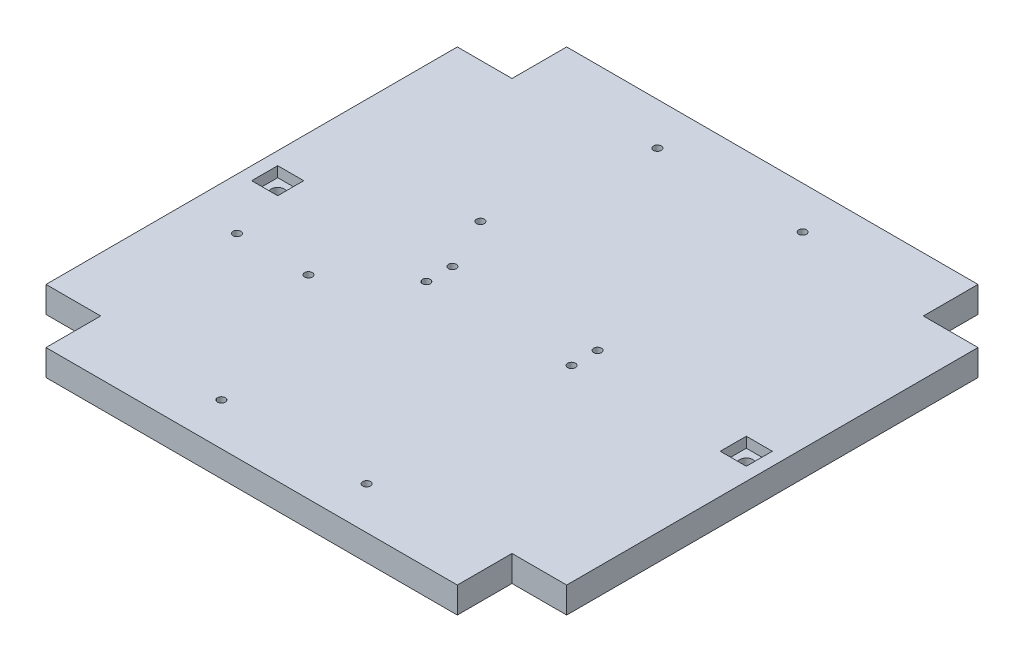
ISO-10303-21;
HEADER;
FILE_DESCRIPTION(('STEP AP214'),'2;1');
FILE_NAME('part.step','',(''),(''),'','','');
FILE_SCHEMA(('AUTOMOTIVE_DESIGN { 1 0 10303 214 1 1 1 1 }'));
ENDSEC;
DATA;
#1=APPLICATION_CONTEXT('core data for automotive mechanical design processes');
#2=APPLICATION_PROTOCOL_DEFINITION('international standard','automotive_design',2000,#1);
#3=PRODUCT_CONTEXT('',#1,'mechanical');
#4=PRODUCT('Part','Part','',(#3));
#5=PRODUCT_RELATED_PRODUCT_CATEGORY('part','',(#4));
#6=PRODUCT_DEFINITION_FORMATION('','',#4);
#7=PRODUCT_DEFINITION_CONTEXT('part definition',#1,'design');
#8=PRODUCT_DEFINITION('design','',#6,#7);
#9=PRODUCT_DEFINITION_SHAPE('','',#8);
#10=(LENGTH_UNIT() NAMED_UNIT(*) SI_UNIT(.MILLI.,.METRE.));
#11=(NAMED_UNIT(*) PLANE_ANGLE_UNIT() SI_UNIT($,.RADIAN.));
#12=(NAMED_UNIT(*) SI_UNIT($,.STERADIAN.) SOLID_ANGLE_UNIT());
#13=UNCERTAINTY_MEASURE_WITH_UNIT(LENGTH_MEASURE(1.E-05),#10,'distance_accuracy_value','');
#14=(GEOMETRIC_REPRESENTATION_CONTEXT(3) GLOBAL_UNCERTAINTY_ASSIGNED_CONTEXT((#13)) GLOBAL_UNIT_ASSIGNED_CONTEXT((#10,
#11,#12)) REPRESENTATION_CONTEXT('',''));
#15=CARTESIAN_POINT('',(0.,0.,0.));
#16=DIRECTION('',(0.,0.,1.));
#17=DIRECTION('',(1.,0.,0.));
#18=AXIS2_PLACEMENT_3D('',#15,#16,#17);
#19=CARTESIAN_POINT('',(90.,0.,0.));
#20=DIRECTION('',(0.,1.,0.));
#21=DIRECTION('',(0.,0.,1.));
#22=AXIS2_PLACEMENT_3D('',#19,#20,#21);
#23=CYLINDRICAL_SURFACE('',#22,2.5);
#24=CARTESIAN_POINT('',(90.,0.,0.));
#25=DIRECTION('',(0.,1.,0.));
#26=DIRECTION('',(0.,0.,-1.));
#27=AXIS2_PLACEMENT_3D('',#24,#25,#26);
#28=CIRCLE('',#27,2.5);
#29=CARTESIAN_POINT('',(90.,0.,-2.5));
#30=VERTEX_POINT('',#29);
#31=EDGE_CURVE('E358',#30,#30,#28,.T.);
#32=ORIENTED_EDGE('',*,*,#31,.F.);
#33=EDGE_LOOP('',(#32));
#34=FACE_BOUND('',#33,.T.);
#35=CARTESIAN_POINT('',(90.,6.,0.));
#36=DIRECTION('',(0.,1.,0.));
#37=DIRECTION('',(0.,0.,1.));
#38=AXIS2_PLACEMENT_3D('',#35,#36,#37);
#39=CIRCLE('',#38,2.5);
#40=CARTESIAN_POINT('',(90.,6.,2.5));
#41=VERTEX_POINT('',#40);
#42=EDGE_CURVE('E43',#41,#41,#39,.F.);
#43=ORIENTED_EDGE('',*,*,#42,.F.);
#44=EDGE_LOOP('',(#43));
#45=FACE_BOUND('',#44,.T.);
#46=ADVANCED_FACE('F39',(#34,#45),#23,.F.);
#47=CARTESIAN_POINT('',(-79.,10.,-100.));
#48=DIRECTION('',(0.,0.,1.));
#49=DIRECTION('',(1.,0.,0.));
#50=AXIS2_PLACEMENT_3D('',#47,#48,#49);
#51=PLANE('',#50);
#52=DIRECTION('',(-1.,0.,0.));
#53=VECTOR('',#52,1.);
#54=CARTESIAN_POINT('',(-79.,0.,-100.));
#55=LINE('',#54,#53);
#56=CARTESIAN_POINT('',(79.,0.,-100.));
#57=VERTEX_POINT('',#56);
#58=CARTESIAN_POINT('',(-79.,0.,-100.));
#59=VERTEX_POINT('',#58);
#60=EDGE_CURVE('E366',#57,#59,#55,.T.);
#61=ORIENTED_EDGE('',*,*,#60,.T.);
#62=DIRECTION('',(0.,-1.,0.));
#63=VECTOR('',#62,1.);
#64=CARTESIAN_POINT('',(-79.,10.,-100.));
#65=LINE('',#64,#63);
#66=CARTESIAN_POINT('',(-79.,10.,-100.));
#67=VERTEX_POINT('',#66);
#68=EDGE_CURVE('E11',#67,#59,#65,.T.);
#69=ORIENTED_EDGE('',*,*,#68,.F.);
#70=DIRECTION('',(-1.,0.,0.));
#71=VECTOR('',#70,1.);
#72=CARTESIAN_POINT('',(-79.,10.,-100.));
#73=LINE('',#72,#71);
#74=CARTESIAN_POINT('',(79.,10.,-100.));
#75=VERTEX_POINT('',#74);
#76=EDGE_CURVE('E370',#75,#67,#73,.T.);
#77=ORIENTED_EDGE('',*,*,#76,.F.);
#78=DIRECTION('',(0.,-1.,0.));
#79=VECTOR('',#78,1.);
#80=CARTESIAN_POINT('',(79.,10.,-100.));
#81=LINE('',#80,#79);
#82=EDGE_CURVE('E408',#75,#57,#81,.T.);
#83=ORIENTED_EDGE('',*,*,#82,.T.);
#84=EDGE_LOOP('',(#61,#69,#77,#83));
#85=FACE_BOUND('',#84,.T.);
#86=ADVANCED_FACE('F41',(#85),#51,.F.);
#87=CARTESIAN_POINT('',(-79.,10.,-100.));
#88=DIRECTION('',(1.,0.,0.));
#89=DIRECTION('',(0.,0.,-1.));
#90=AXIS2_PLACEMENT_3D('',#87,#88,#89);
#91=PLANE('',#90);
#92=DIRECTION('',(0.,0.,1.));
#93=VECTOR('',#92,1.);
#94=CARTESIAN_POINT('',(-79.,0.,-100.));
#95=LINE('',#94,#93);
#96=CARTESIAN_POINT('',(-79.,0.,-79.));
#97=VERTEX_POINT('',#96);
#98=EDGE_CURVE('E412',#59,#97,#95,.T.);
#99=ORIENTED_EDGE('',*,*,#98,.T.);
#100=DIRECTION('',(0.,-1.,0.));
#101=VECTOR('',#100,1.);
#102=CARTESIAN_POINT('',(-79.,10.,-79.));
#103=LINE('',#102,#101);
#104=CARTESIAN_POINT('',(-79.,10.,-79.));
#105=VERTEX_POINT('',#104);
#106=EDGE_CURVE('E49',#105,#97,#103,.T.);
#107=ORIENTED_EDGE('',*,*,#106,.F.);
#108=DIRECTION('',(0.,0.,1.));
#109=VECTOR('',#108,1.);
#110=CARTESIAN_POINT('',(-79.,10.,-100.));
#111=LINE('',#110,#109);
#112=EDGE_CURVE('E374',#67,#105,#111,.T.);
#113=ORIENTED_EDGE('',*,*,#112,.F.);
#114=ORIENTED_EDGE('',*,*,#68,.T.);
#115=EDGE_LOOP('',(#99,#107,#113,#114));
#116=FACE_BOUND('',#115,.T.);
#117=ADVANCED_FACE('F501',(#116),#91,.F.);
#118=CARTESIAN_POINT('',(-79.,10.,-79.));
#119=DIRECTION('',(0.,0.,1.));
#120=DIRECTION('',(1.,0.,0.));
#121=AXIS2_PLACEMENT_3D('',#118,#119,#120);
#122=PLANE('',#121);
#123=DIRECTION('',(-1.,0.,0.));
#124=VECTOR('',#123,1.);
#125=CARTESIAN_POINT('',(-79.,0.,-79.));
#126=LINE('',#125,#124);
#127=CARTESIAN_POINT('',(-100.,0.,-79.));
#128=VERTEX_POINT('',#127);
#129=EDGE_CURVE('E415',#97,#128,#126,.T.);
#130=ORIENTED_EDGE('',*,*,#129,.T.);
#131=DIRECTION('',(0.,-1.,0.));
#132=VECTOR('',#131,1.);
#133=CARTESIAN_POINT('',(-100.,10.,-79.));
#134=LINE('',#133,#132);
#135=CARTESIAN_POINT('',(-100.,10.,-79.));
#136=VERTEX_POINT('',#135);
#137=EDGE_CURVE('E479',#136,#128,#134,.T.);
#138=ORIENTED_EDGE('',*,*,#137,.F.);
#139=DIRECTION('',(-1.,0.,0.));
#140=VECTOR('',#139,1.);
#141=CARTESIAN_POINT('',(-79.,10.,-79.));
#142=LINE('',#141,#140);
#143=EDGE_CURVE('E378',#105,#136,#142,.T.);
#144=ORIENTED_EDGE('',*,*,#143,.F.);
#145=ORIENTED_EDGE('',*,*,#106,.T.);
#146=EDGE_LOOP('',(#130,#138,#144,#145));
#147=FACE_BOUND('',#146,.T.);
#148=ADVANCED_FACE('F551',(#147),#122,.F.);
#149=CARTESIAN_POINT('',(-100.,10.,79.));
#150=DIRECTION('',(1.,0.,0.));
#151=DIRECTION('',(0.,0.,-1.));
#152=AXIS2_PLACEMENT_3D('',#149,#150,#151);
#153=PLANE('',#152);
#154=DIRECTION('',(0.,0.,1.));
#155=VECTOR('',#154,1.);
#156=CARTESIAN_POINT('',(-100.,0.,79.));
#157=LINE('',#156,#155);
#158=CARTESIAN_POINT('',(-100.,0.,79.));
#159=VERTEX_POINT('',#158);
#160=EDGE_CURVE('E418',#128,#159,#157,.T.);
#161=ORIENTED_EDGE('',*,*,#160,.T.);
#162=DIRECTION('',(0.,-1.,0.));
#163=VECTOR('',#162,1.);
#164=CARTESIAN_POINT('',(-100.,10.,79.));
#165=LINE('',#164,#163);
#166=CARTESIAN_POINT('',(-100.,10.,79.));
#167=VERTEX_POINT('',#166);
#168=EDGE_CURVE('E475',#167,#159,#165,.T.);
#169=ORIENTED_EDGE('',*,*,#168,.F.);
#170=DIRECTION('',(0.,0.,1.));
#171=VECTOR('',#170,1.);
#172=CARTESIAN_POINT('',(-100.,10.,79.));
#173=LINE('',#172,#171);
#174=EDGE_CURVE('E381',#136,#167,#173,.T.);
#175=ORIENTED_EDGE('',*,*,#174,.F.);
#176=ORIENTED_EDGE('',*,*,#137,.T.);
#177=EDGE_LOOP('',(#161,#169,#175,#176));
#178=FACE_BOUND('',#177,.T.);
#179=ADVANCED_FACE('F547',(#178),#153,.F.);
#180=CARTESIAN_POINT('',(-78.9999999999999,10.,79.));
#181=DIRECTION('',(0.,0.,-1.));
#182=DIRECTION('',(-1.,0.,0.));
#183=AXIS2_PLACEMENT_3D('',#180,#181,#182);
#184=PLANE('',#183);
#185=DIRECTION('',(1.,0.,0.));
#186=VECTOR('',#185,1.);
#187=CARTESIAN_POINT('',(-78.9999999999999,0.,79.));
#188=LINE('',#187,#186);
#189=CARTESIAN_POINT('',(-78.9999999999999,0.,79.));
#190=VERTEX_POINT('',#189);
#191=EDGE_CURVE('E421',#159,#190,#188,.T.);
#192=ORIENTED_EDGE('',*,*,#191,.T.);
#193=DIRECTION('',(0.,-1.,0.));
#194=VECTOR('',#193,1.);
#195=CARTESIAN_POINT('',(-78.9999999999999,10.,79.));
#196=LINE('',#195,#194);
#197=CARTESIAN_POINT('',(-78.9999999999999,10.,79.));
#198=VERTEX_POINT('',#197);
#199=EDGE_CURVE('E471',#198,#190,#196,.T.);
#200=ORIENTED_EDGE('',*,*,#199,.F.);
#201=DIRECTION('',(1.,0.,0.));
#202=VECTOR('',#201,1.);
#203=CARTESIAN_POINT('',(-78.9999999999999,10.,79.));
#204=LINE('',#203,#202);
#205=EDGE_CURVE('E384',#167,#198,#204,.T.);
#206=ORIENTED_EDGE('',*,*,#205,.F.);
#207=ORIENTED_EDGE('',*,*,#168,.T.);
#208=EDGE_LOOP('',(#192,#200,#206,#207));
#209=FACE_BOUND('',#208,.T.);
#210=ADVANCED_FACE('F543',(#209),#184,.F.);
#211=CARTESIAN_POINT('',(-78.9999999999999,10.,100.));
#212=DIRECTION('',(1.,0.,0.));
#213=DIRECTION('',(0.,0.,-1.));
#214=AXIS2_PLACEMENT_3D('',#211,#212,#213);
#215=PLANE('',#214);
#216=DIRECTION('',(0.,0.,1.));
#217=VECTOR('',#216,1.);
#218=CARTESIAN_POINT('',(-78.9999999999999,0.,100.));
#219=LINE('',#218,#217);
#220=CARTESIAN_POINT('',(-78.9999999999999,0.,100.));
#221=VERTEX_POINT('',#220);
#222=EDGE_CURVE('E424',#190,#221,#219,.T.);
#223=ORIENTED_EDGE('',*,*,#222,.T.);
#224=DIRECTION('',(0.,-1.,0.));
#225=VECTOR('',#224,1.);
#226=CARTESIAN_POINT('',(-78.9999999999999,10.,100.));
#227=LINE('',#226,#225);
#228=CARTESIAN_POINT('',(-78.9999999999999,10.,100.));
#229=VERTEX_POINT('',#228);
#230=EDGE_CURVE('E467',#229,#221,#227,.T.);
#231=ORIENTED_EDGE('',*,*,#230,.F.);
#232=DIRECTION('',(0.,0.,1.));
#233=VECTOR('',#232,1.);
#234=CARTESIAN_POINT('',(-78.9999999999999,10.,100.));
#235=LINE('',#234,#233);
#236=EDGE_CURVE('E387',#198,#229,#235,.T.);
#237=ORIENTED_EDGE('',*,*,#236,.F.);
#238=ORIENTED_EDGE('',*,*,#199,.T.);
#239=EDGE_LOOP('',(#223,#231,#237,#238));
#240=FACE_BOUND('',#239,.T.);
#241=ADVANCED_FACE('F539',(#240),#215,.F.);
#242=CARTESIAN_POINT('',(-78.9999999999999,10.,100.));
#243=DIRECTION('',(0.,0.,-1.));
#244=DIRECTION('',(-1.,0.,0.));
#245=AXIS2_PLACEMENT_3D('',#242,#243,#244);
#246=PLANE('',#245);
#247=DIRECTION('',(1.,0.,0.));
#248=VECTOR('',#247,1.);
#249=CARTESIAN_POINT('',(-78.9999999999999,0.,100.));
#250=LINE('',#249,#248);
#251=CARTESIAN_POINT('',(79.,0.,100.));
#252=VERTEX_POINT('',#251);
#253=EDGE_CURVE('E427',#221,#252,#250,.T.);
#254=ORIENTED_EDGE('',*,*,#253,.T.);
#255=DIRECTION('',(0.,-1.,0.));
#256=VECTOR('',#255,1.);
#257=CARTESIAN_POINT('',(79.,10.,100.));
#258=LINE('',#257,#256);
#259=CARTESIAN_POINT('',(79.,10.,100.));
#260=VERTEX_POINT('',#259);
#261=EDGE_CURVE('E463',#260,#252,#258,.T.);
#262=ORIENTED_EDGE('',*,*,#261,.F.);
#263=DIRECTION('',(1.,0.,0.));
#264=VECTOR('',#263,1.);
#265=CARTESIAN_POINT('',(-78.9999999999999,10.,100.));
#266=LINE('',#265,#264);
#267=EDGE_CURVE('E390',#229,#260,#266,.T.);
#268=ORIENTED_EDGE('',*,*,#267,.F.);
#269=ORIENTED_EDGE('',*,*,#230,.T.);
#270=EDGE_LOOP('',(#254,#262,#268,#269));
#271=FACE_BOUND('',#270,.T.);
#272=ADVANCED_FACE('F535',(#271),#246,.F.);
#273=CARTESIAN_POINT('',(79.,10.,100.));
#274=DIRECTION('',(-1.,0.,0.));
#275=DIRECTION('',(0.,0.,1.));
#276=AXIS2_PLACEMENT_3D('',#273,#274,#275);
#277=PLANE('',#276);
#278=DIRECTION('',(0.,0.,-1.));
#279=VECTOR('',#278,1.);
#280=CARTESIAN_POINT('',(79.,0.,100.));
#281=LINE('',#280,#279);
#282=CARTESIAN_POINT('',(79.,0.,79.));
#283=VERTEX_POINT('',#282);
#284=EDGE_CURVE('E430',#252,#283,#281,.T.);
#285=ORIENTED_EDGE('',*,*,#284,.T.);
#286=DIRECTION('',(0.,-1.,0.));
#287=VECTOR('',#286,1.);
#288=CARTESIAN_POINT('',(79.,10.,79.));
#289=LINE('',#288,#287);
#290=CARTESIAN_POINT('',(79.,10.,79.));
#291=VERTEX_POINT('',#290);
#292=EDGE_CURVE('E459',#291,#283,#289,.T.);
#293=ORIENTED_EDGE('',*,*,#292,.F.);
#294=DIRECTION('',(0.,0.,-1.));
#295=VECTOR('',#294,1.);
#296=CARTESIAN_POINT('',(79.,10.,100.));
#297=LINE('',#296,#295);
#298=EDGE_CURVE('E393',#260,#291,#297,.T.);
#299=ORIENTED_EDGE('',*,*,#298,.F.);
#300=ORIENTED_EDGE('',*,*,#261,.T.);
#301=EDGE_LOOP('',(#285,#293,#299,#300));
#302=FACE_BOUND('',#301,.T.);
#303=ADVANCED_FACE('F531',(#302),#277,.F.);
#304=CARTESIAN_POINT('',(79.,10.,79.));
#305=DIRECTION('',(0.,0.,-1.));
#306=DIRECTION('',(-1.,0.,0.));
#307=AXIS2_PLACEMENT_3D('',#304,#305,#306);
#308=PLANE('',#307);
#309=DIRECTION('',(1.,0.,0.));
#310=VECTOR('',#309,1.);
#311=CARTESIAN_POINT('',(79.,0.,79.));
#312=LINE('',#311,#310);
#313=CARTESIAN_POINT('',(100.,0.,79.));
#314=VERTEX_POINT('',#313);
#315=EDGE_CURVE('E433',#283,#314,#312,.T.);
#316=ORIENTED_EDGE('',*,*,#315,.T.);
#317=DIRECTION('',(0.,-1.,0.));
#318=VECTOR('',#317,1.);
#319=CARTESIAN_POINT('',(100.,10.,79.));
#320=LINE('',#319,#318);
#321=CARTESIAN_POINT('',(100.,10.,79.));
#322=VERTEX_POINT('',#321);
#323=EDGE_CURVE('E455',#322,#314,#320,.T.);
#324=ORIENTED_EDGE('',*,*,#323,.F.);
#325=DIRECTION('',(1.,0.,0.));
#326=VECTOR('',#325,1.);
#327=CARTESIAN_POINT('',(79.,10.,79.));
#328=LINE('',#327,#326);
#329=EDGE_CURVE('E396',#291,#322,#328,.T.);
#330=ORIENTED_EDGE('',*,*,#329,.F.);
#331=ORIENTED_EDGE('',*,*,#292,.T.);
#332=EDGE_LOOP('',(#316,#324,#330,#331));
#333=FACE_BOUND('',#332,.T.);
#334=ADVANCED_FACE('F527',(#333),#308,.F.);
#335=CARTESIAN_POINT('',(100.,10.,79.));
#336=DIRECTION('',(-1.,0.,0.));
#337=DIRECTION('',(0.,0.,1.));
#338=AXIS2_PLACEMENT_3D('',#335,#336,#337);
#339=PLANE('',#338);
#340=DIRECTION('',(0.,0.,-1.));
#341=VECTOR('',#340,1.);
#342=CARTESIAN_POINT('',(100.,0.,79.));
#343=LINE('',#342,#341);
#344=CARTESIAN_POINT('',(100.,0.,-79.));
#345=VERTEX_POINT('',#344);
#346=EDGE_CURVE('E436',#314,#345,#343,.T.);
#347=ORIENTED_EDGE('',*,*,#346,.T.);
#348=DIRECTION('',(0.,-1.,0.));
#349=VECTOR('',#348,1.);
#350=CARTESIAN_POINT('',(100.,10.,-79.));
#351=LINE('',#350,#349);
#352=CARTESIAN_POINT('',(100.,10.,-79.));
#353=VERTEX_POINT('',#352);
#354=EDGE_CURVE('E451',#353,#345,#351,.T.);
#355=ORIENTED_EDGE('',*,*,#354,.F.);
#356=DIRECTION('',(0.,0.,-1.));
#357=VECTOR('',#356,1.);
#358=CARTESIAN_POINT('',(100.,10.,79.));
#359=LINE('',#358,#357);
#360=EDGE_CURVE('E399',#322,#353,#359,.T.);
#361=ORIENTED_EDGE('',*,*,#360,.F.);
#362=ORIENTED_EDGE('',*,*,#323,.T.);
#363=EDGE_LOOP('',(#347,#355,#361,#362));
#364=FACE_BOUND('',#363,.T.);
#365=ADVANCED_FACE('F523',(#364),#339,.F.);
#366=CARTESIAN_POINT('',(79.,10.,-79.));
#367=DIRECTION('',(0.,0.,1.));
#368=DIRECTION('',(1.,0.,0.));
#369=AXIS2_PLACEMENT_3D('',#366,#367,#368);
#370=PLANE('',#369);
#371=DIRECTION('',(-1.,0.,0.));
#372=VECTOR('',#371,1.);
#373=CARTESIAN_POINT('',(79.,0.,-79.));
#374=LINE('',#373,#372);
#375=CARTESIAN_POINT('',(79.,0.,-79.));
#376=VERTEX_POINT('',#375);
#377=EDGE_CURVE('E439',#345,#376,#374,.T.);
#378=ORIENTED_EDGE('',*,*,#377,.T.);
#379=DIRECTION('',(0.,-1.,0.));
#380=VECTOR('',#379,1.);
#381=CARTESIAN_POINT('',(79.,10.,-79.));
#382=LINE('',#381,#380);
#383=CARTESIAN_POINT('',(79.,10.,-79.));
#384=VERTEX_POINT('',#383);
#385=EDGE_CURVE('E447',#384,#376,#382,.T.);
#386=ORIENTED_EDGE('',*,*,#385,.F.);
#387=DIRECTION('',(-1.,0.,0.));
#388=VECTOR('',#387,1.);
#389=CARTESIAN_POINT('',(79.,10.,-79.));
#390=LINE('',#389,#388);
#391=EDGE_CURVE('E402',#353,#384,#390,.T.);
#392=ORIENTED_EDGE('',*,*,#391,.F.);
#393=ORIENTED_EDGE('',*,*,#354,.T.);
#394=EDGE_LOOP('',(#378,#386,#392,#393));
#395=FACE_BOUND('',#394,.T.);
#396=ADVANCED_FACE('F519',(#395),#370,.F.);
#397=CARTESIAN_POINT('',(79.,10.,-100.));
#398=DIRECTION('',(-1.,0.,0.));
#399=DIRECTION('',(0.,0.,1.));
#400=AXIS2_PLACEMENT_3D('',#397,#398,#399);
#401=PLANE('',#400);
#402=DIRECTION('',(0.,0.,-1.));
#403=VECTOR('',#402,1.);
#404=CARTESIAN_POINT('',(79.,0.,-100.));
#405=LINE('',#404,#403);
#406=EDGE_CURVE('E375',#376,#57,#405,.T.);
#407=ORIENTED_EDGE('',*,*,#406,.T.);
#408=ORIENTED_EDGE('',*,*,#82,.F.);
#409=DIRECTION('',(0.,0.,-1.));
#410=VECTOR('',#409,1.);
#411=CARTESIAN_POINT('',(79.,10.,-100.));
#412=LINE('',#411,#410);
#413=EDGE_CURVE('E405',#384,#75,#412,.T.);
#414=ORIENTED_EDGE('',*,*,#413,.F.);
#415=ORIENTED_EDGE('',*,*,#385,.T.);
#416=EDGE_LOOP('',(#407,#408,#414,#415));
#417=FACE_BOUND('',#416,.T.);
#418=ADVANCED_FACE('F512',(#417),#401,.F.);
#419=CARTESIAN_POINT('',(0.,10.,0.));
#420=DIRECTION('',(0.,-1.,0.));
#421=DIRECTION('',(0.,0.,-1.));
#422=AXIS2_PLACEMENT_3D('',#419,#420,#421);
#423=PLANE('',#422);
#424=DIRECTION('',(-1.,0.,0.));
#425=VECTOR('',#424,1.);
#426=CARTESIAN_POINT('',(-95.,10.,-5.));
#427=LINE('',#426,#425);
#428=CARTESIAN_POINT('',(-85.,10.,-5.));
#429=VERTEX_POINT('',#428);
#430=CARTESIAN_POINT('',(-95.,10.,-5.));
#431=VERTEX_POINT('',#430);
#432=EDGE_CURVE('E216',#429,#431,#427,.T.);
#433=ORIENTED_EDGE('',*,*,#432,.F.);
#434=DIRECTION('',(0.,0.,-1.));
#435=VECTOR('',#434,1.);
#436=CARTESIAN_POINT('',(-85.,10.,5.));
#437=LINE('',#436,#435);
#438=CARTESIAN_POINT('',(-85.,10.,5.));
#439=VERTEX_POINT('',#438);
#440=EDGE_CURVE('E57',#439,#429,#437,.T.);
#441=ORIENTED_EDGE('',*,*,#440,.F.);
#442=DIRECTION('',(1.,0.,0.));
#443=VECTOR('',#442,1.);
#444=CARTESIAN_POINT('',(-95.,10.,5.));
#445=LINE('',#444,#443);
#446=CARTESIAN_POINT('',(-95.,10.,5.));
#447=VERTEX_POINT('',#446);
#448=EDGE_CURVE('E203',#447,#439,#445,.T.);
#449=ORIENTED_EDGE('',*,*,#448,.F.);
#450=DIRECTION('',(0.,0.,1.));
#451=VECTOR('',#450,1.);
#452=CARTESIAN_POINT('',(-95.,10.,5.));
#453=LINE('',#452,#451);
#454=EDGE_CURVE('E207',#431,#447,#453,.T.);
#455=ORIENTED_EDGE('',*,*,#454,.F.);
#456=EDGE_LOOP('',(#433,#441,#449,#455));
#457=FACE_BOUND('',#456,.T.);
#458=DIRECTION('',(1.,0.,0.));
#459=VECTOR('',#458,1.);
#460=CARTESIAN_POINT('',(95.,10.,5.00000000000001));
#461=LINE('',#460,#459);
#462=CARTESIAN_POINT('',(85.,10.,5.00000000000001));
#463=VERTEX_POINT('',#462);
#464=CARTESIAN_POINT('',(95.,10.,5.00000000000001));
#465=VERTEX_POINT('',#464);
#466=EDGE_CURVE('E252',#463,#465,#461,.T.);
#467=ORIENTED_EDGE('',*,*,#466,.F.);
#468=DIRECTION('',(0.,0.,1.));
#469=VECTOR('',#468,1.);
#470=CARTESIAN_POINT('',(85.,10.,5.00000000000001));
#471=LINE('',#470,#469);
#472=CARTESIAN_POINT('',(85.,10.,-4.99999999999999));
#473=VERTEX_POINT('',#472);
#474=EDGE_CURVE('E65',#473,#463,#471,.T.);
#475=ORIENTED_EDGE('',*,*,#474,.F.);
#476=DIRECTION('',(-1.,0.,0.));
#477=VECTOR('',#476,1.);
#478=CARTESIAN_POINT('',(95.,10.,-4.99999999999999));
#479=LINE('',#478,#477);
#480=CARTESIAN_POINT('',(95.,10.,-4.99999999999999));
#481=VERTEX_POINT('',#480);
#482=EDGE_CURVE('E237',#481,#473,#479,.T.);
#483=ORIENTED_EDGE('',*,*,#482,.F.);
#484=DIRECTION('',(0.,0.,-1.));
#485=VECTOR('',#484,1.);
#486=CARTESIAN_POINT('',(95.,10.,5.00000000000001));
#487=LINE('',#486,#485);
#488=EDGE_CURVE('E256',#465,#481,#487,.T.);
#489=ORIENTED_EDGE('',*,*,#488,.F.);
#490=EDGE_LOOP('',(#467,#475,#483,#489));
#491=FACE_BOUND('',#490,.T.);
#492=CARTESIAN_POINT('',(-37.54,10.,-25.4));
#493=DIRECTION('',(0.,1.,0.));
#494=DIRECTION('',(0.,0.,1.));
#495=AXIS2_PLACEMENT_3D('',#492,#493,#494);
#496=CIRCLE('',#495,1.5);
#497=CARTESIAN_POINT('',(-37.54,10.,-23.9));
#498=VERTEX_POINT('',#497);
#499=EDGE_CURVE('E278',#498,#498,#496,.T.);
#500=ORIENTED_EDGE('',*,*,#499,.F.);
#501=EDGE_LOOP('',(#500));
#502=FACE_BOUND('',#501,.T.);
#503=CARTESIAN_POINT('',(-52.78,10.,25.4));
#504=DIRECTION('',(0.,1.,0.));
#505=DIRECTION('',(0.,0.,1.));
#506=AXIS2_PLACEMENT_3D('',#503,#504,#505);
#507=CIRCLE('',#506,1.5);
#508=CARTESIAN_POINT('',(-52.78,10.,26.9));
#509=VERTEX_POINT('',#508);
#510=EDGE_CURVE('E286',#509,#509,#507,.T.);
#511=ORIENTED_EDGE('',*,*,#510,.F.);
#512=EDGE_LOOP('',(#511));
#513=FACE_BOUND('',#512,.T.);
#514=CARTESIAN_POINT('',(-80.27,10.,25.4));
#515=DIRECTION('',(0.,1.,0.));
#516=DIRECTION('',(0.,0.,1.));
#517=AXIS2_PLACEMENT_3D('',#514,#515,#516);
#518=CIRCLE('',#517,1.5);
#519=CARTESIAN_POINT('',(-80.27,10.,26.9));
#520=VERTEX_POINT('',#519);
#521=EDGE_CURVE('E294',#520,#520,#518,.T.);
#522=ORIENTED_EDGE('',*,*,#521,.F.);
#523=EDGE_LOOP('',(#522));
#524=FACE_BOUND('',#523,.T.);
#525=CARTESIAN_POINT('',(-27.9,10.,5.));
#526=DIRECTION('',(0.,1.,0.));
#527=DIRECTION('',(0.,0.,1.));
#528=AXIS2_PLACEMENT_3D('',#525,#526,#527);
#529=CIRCLE('',#528,1.5);
#530=CARTESIAN_POINT('',(-27.9,10.,6.5));
#531=VERTEX_POINT('',#530);
#532=EDGE_CURVE('E302',#531,#531,#529,.T.);
#533=ORIENTED_EDGE('',*,*,#532,.F.);
#534=EDGE_LOOP('',(#533));
#535=FACE_BOUND('',#534,.T.);
#536=CARTESIAN_POINT('',(-27.9,10.,-83.74));
#537=DIRECTION('',(0.,1.,0.));
#538=DIRECTION('',(0.,0.,-1.));
#539=AXIS2_PLACEMENT_3D('',#536,#537,#538);
#540=CIRCLE('',#539,1.5);
#541=CARTESIAN_POINT('',(-27.9,10.,-85.24));
#542=VERTEX_POINT('',#541);
#543=EDGE_CURVE('E327',#542,#542,#540,.T.);
#544=ORIENTED_EDGE('',*,*,#543,.F.);
#545=EDGE_LOOP('',(#544));
#546=FACE_BOUND('',#545,.T.);
#547=CARTESIAN_POINT('',(-27.9,10.,-5.));
#548=DIRECTION('',(0.,1.,0.));
#549=DIRECTION('',(0.,0.,-1.));
#550=AXIS2_PLACEMENT_3D('',#547,#548,#549);
#551=CIRCLE('',#550,1.5);
#552=CARTESIAN_POINT('',(-27.9,10.,-6.5));
#553=VERTEX_POINT('',#552);
#554=EDGE_CURVE('E326',#553,#553,#551,.T.);
#555=ORIENTED_EDGE('',*,*,#554,.F.);
#556=EDGE_LOOP('',(#555));
#557=FACE_BOUND('',#556,.T.);
#558=CARTESIAN_POINT('',(27.9,10.,-5.));
#559=DIRECTION('',(0.,1.,0.));
#560=DIRECTION('',(0.,0.,1.));
#561=AXIS2_PLACEMENT_3D('',#558,#559,#560);
#562=CIRCLE('',#561,1.5);
#563=CARTESIAN_POINT('',(27.9,10.,-3.5));
#564=VERTEX_POINT('',#563);
#565=EDGE_CURVE('E343',#564,#564,#562,.T.);
#566=ORIENTED_EDGE('',*,*,#565,.F.);
#567=EDGE_LOOP('',(#566));
#568=FACE_BOUND('',#567,.T.);
#569=CARTESIAN_POINT('',(27.9,10.,5.));
#570=DIRECTION('',(0.,1.,0.));
#571=DIRECTION('',(0.,0.,-1.));
#572=AXIS2_PLACEMENT_3D('',#569,#570,#571);
#573=CIRCLE('',#572,1.5);
#574=CARTESIAN_POINT('',(27.9,10.,3.5));
#575=VERTEX_POINT('',#574);
#576=EDGE_CURVE('E303',#575,#575,#573,.T.);
#577=ORIENTED_EDGE('',*,*,#576,.F.);
#578=EDGE_LOOP('',(#577));
#579=FACE_BOUND('',#578,.T.);
#580=CARTESIAN_POINT('',(27.9,10.,83.74));
#581=DIRECTION('',(0.,1.,0.));
#582=DIRECTION('',(0.,0.,-1.));
#583=AXIS2_PLACEMENT_3D('',#580,#581,#582);
#584=CIRCLE('',#583,1.5);
#585=CARTESIAN_POINT('',(27.9,10.,82.24));
#586=VERTEX_POINT('',#585);
#587=EDGE_CURVE('E311',#586,#586,#584,.T.);
#588=ORIENTED_EDGE('',*,*,#587,.F.);
#589=EDGE_LOOP('',(#588));
#590=FACE_BOUND('',#589,.T.);
#591=CARTESIAN_POINT('',(-27.9,10.,83.74));
#592=DIRECTION('',(0.,1.,0.));
#593=DIRECTION('',(0.,0.,1.));
#594=AXIS2_PLACEMENT_3D('',#591,#592,#593);
#595=CIRCLE('',#594,1.5);
#596=CARTESIAN_POINT('',(-27.9,10.,85.24));
#597=VERTEX_POINT('',#596);
#598=EDGE_CURVE('E277',#597,#597,#595,.T.);
#599=ORIENTED_EDGE('',*,*,#598,.F.);
#600=EDGE_LOOP('',(#599));
#601=FACE_BOUND('',#600,.T.);
#602=CARTESIAN_POINT('',(27.9,10.,-83.74));
#603=DIRECTION('',(0.,1.,0.));
#604=DIRECTION('',(0.,0.,1.));
#605=AXIS2_PLACEMENT_3D('',#602,#603,#604);
#606=CIRCLE('',#605,1.5);
#607=CARTESIAN_POINT('',(27.9,10.,-82.24));
#608=VERTEX_POINT('',#607);
#609=EDGE_CURVE('E342',#608,#608,#606,.T.);
#610=ORIENTED_EDGE('',*,*,#609,.F.);
#611=EDGE_LOOP('',(#610));
#612=FACE_BOUND('',#611,.T.);
#613=ORIENTED_EDGE('',*,*,#76,.T.);
#614=ORIENTED_EDGE('',*,*,#112,.T.);
#615=ORIENTED_EDGE('',*,*,#143,.T.);
#616=ORIENTED_EDGE('',*,*,#174,.T.);
#617=ORIENTED_EDGE('',*,*,#205,.T.);
#618=ORIENTED_EDGE('',*,*,#236,.T.);
#619=ORIENTED_EDGE('',*,*,#267,.T.);
#620=ORIENTED_EDGE('',*,*,#298,.T.);
#621=ORIENTED_EDGE('',*,*,#329,.T.);
#622=ORIENTED_EDGE('',*,*,#360,.T.);
#623=ORIENTED_EDGE('',*,*,#391,.T.);
#624=ORIENTED_EDGE('',*,*,#413,.T.);
#625=EDGE_LOOP('',(#613,#614,#615,#616,#617,#618,#619,#620,#621,#622,#623,#624));
#626=FACE_BOUND('',#625,.T.);
#627=ADVANCED_FACE('F508',(#457,#491,#502,#513,#524,#535,#546,#557,#568,#579,#590,#601,#612,
#626),#423,.F.);
#628=CARTESIAN_POINT('',(0.,0.,0.));
#629=DIRECTION('',(0.,-1.,0.));
#630=DIRECTION('',(0.,0.,-1.));
#631=AXIS2_PLACEMENT_3D('',#628,#629,#630);
#632=PLANE('',#631);
#633=CARTESIAN_POINT('',(-37.54,0.,-25.4));
#634=DIRECTION('',(0.,1.,0.));
#635=DIRECTION('',(0.,0.,1.));
#636=AXIS2_PLACEMENT_3D('',#633,#634,#635);
#637=CIRCLE('',#636,1.5);
#638=CARTESIAN_POINT('',(-37.54,0.,-23.9));
#639=VERTEX_POINT('',#638);
#640=EDGE_CURVE('E273',#639,#639,#637,.T.);
#641=ORIENTED_EDGE('',*,*,#640,.T.);
#642=EDGE_LOOP('',(#641));
#643=FACE_BOUND('',#642,.T.);
#644=CARTESIAN_POINT('',(-52.78,0.,25.4));
#645=DIRECTION('',(0.,1.,0.));
#646=DIRECTION('',(0.,0.,1.));
#647=AXIS2_PLACEMENT_3D('',#644,#645,#646);
#648=CIRCLE('',#647,1.5);
#649=CARTESIAN_POINT('',(-52.78,0.,26.9));
#650=VERTEX_POINT('',#649);
#651=EDGE_CURVE('E282',#650,#650,#648,.T.);
#652=ORIENTED_EDGE('',*,*,#651,.T.);
#653=EDGE_LOOP('',(#652));
#654=FACE_BOUND('',#653,.T.);
#655=CARTESIAN_POINT('',(-80.27,0.,25.4));
#656=DIRECTION('',(0.,1.,0.));
#657=DIRECTION('',(0.,0.,1.));
#658=AXIS2_PLACEMENT_3D('',#655,#656,#657);
#659=CIRCLE('',#658,1.5);
#660=CARTESIAN_POINT('',(-80.27,0.,26.9));
#661=VERTEX_POINT('',#660);
#662=EDGE_CURVE('E290',#661,#661,#659,.T.);
#663=ORIENTED_EDGE('',*,*,#662,.T.);
#664=EDGE_LOOP('',(#663));
#665=FACE_BOUND('',#664,.T.);
#666=CARTESIAN_POINT('',(-27.9,0.,5.));
#667=DIRECTION('',(0.,1.,0.));
#668=DIRECTION('',(0.,0.,1.));
#669=AXIS2_PLACEMENT_3D('',#666,#667,#668);
#670=CIRCLE('',#669,1.5);
#671=CARTESIAN_POINT('',(-27.9,0.,6.5));
#672=VERTEX_POINT('',#671);
#673=EDGE_CURVE('E331',#672,#672,#670,.T.);
#674=ORIENTED_EDGE('',*,*,#673,.T.);
#675=EDGE_LOOP('',(#674));
#676=FACE_BOUND('',#675,.T.);
#677=CARTESIAN_POINT('',(-27.9,0.,-83.74));
#678=DIRECTION('',(0.,1.,0.));
#679=DIRECTION('',(0.,0.,-1.));
#680=AXIS2_PLACEMENT_3D('',#677,#678,#679);
#681=CIRCLE('',#680,1.5);
#682=CARTESIAN_POINT('',(-27.9,0.,-85.24));
#683=VERTEX_POINT('',#682);
#684=EDGE_CURVE('E322',#683,#683,#681,.T.);
#685=ORIENTED_EDGE('',*,*,#684,.T.);
#686=EDGE_LOOP('',(#685));
#687=FACE_BOUND('',#686,.T.);
#688=CARTESIAN_POINT('',(-27.9,0.,-5.));
#689=DIRECTION('',(0.,1.,0.));
#690=DIRECTION('',(0.,0.,-1.));
#691=AXIS2_PLACEMENT_3D('',#688,#689,#690);
#692=CIRCLE('',#691,1.5);
#693=CARTESIAN_POINT('',(-27.9,0.,-6.5));
#694=VERTEX_POINT('',#693);
#695=EDGE_CURVE('E347',#694,#694,#692,.T.);
#696=ORIENTED_EDGE('',*,*,#695,.T.);
#697=EDGE_LOOP('',(#696));
#698=FACE_BOUND('',#697,.T.);
#699=CARTESIAN_POINT('',(27.9,0.,-5.));
#700=DIRECTION('',(0.,1.,0.));
#701=DIRECTION('',(0.,0.,1.));
#702=AXIS2_PLACEMENT_3D('',#699,#700,#701);
#703=CIRCLE('',#702,1.5);
#704=CARTESIAN_POINT('',(27.9,0.,-3.5));
#705=VERTEX_POINT('',#704);
#706=EDGE_CURVE('E338',#705,#705,#703,.T.);
#707=ORIENTED_EDGE('',*,*,#706,.T.);
#708=EDGE_LOOP('',(#707));
#709=FACE_BOUND('',#708,.T.);
#710=CARTESIAN_POINT('',(27.9,0.,5.));
#711=DIRECTION('',(0.,1.,0.));
#712=DIRECTION('',(0.,0.,-1.));
#713=AXIS2_PLACEMENT_3D('',#710,#711,#712);
#714=CIRCLE('',#713,1.5);
#715=CARTESIAN_POINT('',(27.9,0.,3.5));
#716=VERTEX_POINT('',#715);
#717=EDGE_CURVE('E298',#716,#716,#714,.T.);
#718=ORIENTED_EDGE('',*,*,#717,.T.);
#719=EDGE_LOOP('',(#718));
#720=FACE_BOUND('',#719,.T.);
#721=CARTESIAN_POINT('',(27.9,0.,83.74));
#722=DIRECTION('',(0.,1.,0.));
#723=DIRECTION('',(0.,0.,-1.));
#724=AXIS2_PLACEMENT_3D('',#721,#722,#723);
#725=CIRCLE('',#724,1.5);
#726=CARTESIAN_POINT('',(27.9,0.,82.24));
#727=VERTEX_POINT('',#726);
#728=EDGE_CURVE('E307',#727,#727,#725,.T.);
#729=ORIENTED_EDGE('',*,*,#728,.T.);
#730=EDGE_LOOP('',(#729));
#731=FACE_BOUND('',#730,.T.);
#732=CARTESIAN_POINT('',(-27.9,0.,83.74));
#733=DIRECTION('',(0.,1.,0.));
#734=DIRECTION('',(0.,0.,1.));
#735=AXIS2_PLACEMENT_3D('',#732,#733,#734);
#736=CIRCLE('',#735,1.5);
#737=CARTESIAN_POINT('',(-27.9,0.,85.24));
#738=VERTEX_POINT('',#737);
#739=EDGE_CURVE('E315',#738,#738,#736,.T.);
#740=ORIENTED_EDGE('',*,*,#739,.T.);
#741=EDGE_LOOP('',(#740));
#742=FACE_BOUND('',#741,.T.);
#743=CARTESIAN_POINT('',(27.9,0.,-83.74));
#744=DIRECTION('',(0.,1.,0.));
#745=DIRECTION('',(0.,0.,1.));
#746=AXIS2_PLACEMENT_3D('',#743,#744,#745);
#747=CIRCLE('',#746,1.5);
#748=CARTESIAN_POINT('',(27.9,0.,-82.24));
#749=VERTEX_POINT('',#748);
#750=EDGE_CURVE('E354',#749,#749,#747,.T.);
#751=ORIENTED_EDGE('',*,*,#750,.T.);
#752=EDGE_LOOP('',(#751));
#753=FACE_BOUND('',#752,.T.);
#754=CARTESIAN_POINT('',(-90.,0.,0.));
#755=DIRECTION('',(0.,1.,0.));
#756=DIRECTION('',(0.,0.,1.));
#757=AXIS2_PLACEMENT_3D('',#754,#755,#756);
#758=CIRCLE('',#757,2.5);
#759=CARTESIAN_POINT('',(-90.,0.,2.5));
#760=VERTEX_POINT('',#759);
#761=EDGE_CURVE('E362',#760,#760,#758,.T.);
#762=ORIENTED_EDGE('',*,*,#761,.T.);
#763=EDGE_LOOP('',(#762));
#764=FACE_BOUND('',#763,.T.);
#765=ORIENTED_EDGE('',*,*,#31,.T.);
#766=EDGE_LOOP('',(#765));
#767=FACE_BOUND('',#766,.T.);
#768=ORIENTED_EDGE('',*,*,#60,.F.);
#769=ORIENTED_EDGE('',*,*,#406,.F.);
#770=ORIENTED_EDGE('',*,*,#377,.F.);
#771=ORIENTED_EDGE('',*,*,#346,.F.);
#772=ORIENTED_EDGE('',*,*,#315,.F.);
#773=ORIENTED_EDGE('',*,*,#284,.F.);
#774=ORIENTED_EDGE('',*,*,#253,.F.);
#775=ORIENTED_EDGE('',*,*,#222,.F.);
#776=ORIENTED_EDGE('',*,*,#191,.F.);
#777=ORIENTED_EDGE('',*,*,#160,.F.);
#778=ORIENTED_EDGE('',*,*,#129,.F.);
#779=ORIENTED_EDGE('',*,*,#98,.F.);
#780=EDGE_LOOP('',(#768,#769,#770,#771,#772,#773,#774,#775,#776,#777,#778,#779));
#781=FACE_BOUND('',#780,.T.);
#782=ADVANCED_FACE('F511',(#643,#654,#665,#676,#687,#698,#709,#720,#731,#742,#753,#764,#767,
#781),#632,.T.);
#783=CARTESIAN_POINT('',(-90.,0.,0.));
#784=DIRECTION('',(0.,1.,0.));
#785=DIRECTION('',(0.,0.,1.));
#786=AXIS2_PLACEMENT_3D('',#783,#784,#785);
#787=CYLINDRICAL_SURFACE('',#786,2.5);
#788=CARTESIAN_POINT('',(-90.,6.,0.));
#789=DIRECTION('',(0.,-1.,0.));
#790=DIRECTION('',(0.,0.,-1.));
#791=AXIS2_PLACEMENT_3D('',#788,#789,#790);
#792=CIRCLE('',#791,2.5);
#793=CARTESIAN_POINT('',(-90.,6.,-2.5));
#794=VERTEX_POINT('',#793);
#795=EDGE_CURVE('E226',#794,#794,#792,.F.);
#796=ORIENTED_EDGE('',*,*,#795,.T.);
#797=EDGE_LOOP('',(#796));
#798=FACE_BOUND('',#797,.T.);
#799=ORIENTED_EDGE('',*,*,#761,.F.);
#800=EDGE_LOOP('',(#799));
#801=FACE_BOUND('',#800,.T.);
#802=ADVANCED_FACE('F506',(#798,#801),#787,.F.);
#803=CARTESIAN_POINT('',(27.9,0.,-83.74));
#804=DIRECTION('',(0.,1.,0.));
#805=DIRECTION('',(0.,0.,1.));
#806=AXIS2_PLACEMENT_3D('',#803,#804,#805);
#807=CYLINDRICAL_SURFACE('',#806,1.5);
#808=ORIENTED_EDGE('',*,*,#750,.F.);
#809=EDGE_LOOP('',(#808));
#810=FACE_BOUND('',#809,.T.);
#811=ORIENTED_EDGE('',*,*,#609,.T.);
#812=EDGE_LOOP('',(#811));
#813=FACE_BOUND('',#812,.T.);
#814=ADVANCED_FACE('F654',(#810,#813),#807,.F.);
#815=CARTESIAN_POINT('',(-27.9,0.,83.74));
#816=DIRECTION('',(0.,1.,0.));
#817=DIRECTION('',(0.,0.,1.));
#818=AXIS2_PLACEMENT_3D('',#815,#816,#817);
#819=CYLINDRICAL_SURFACE('',#818,1.5);
#820=ORIENTED_EDGE('',*,*,#739,.F.);
#821=EDGE_LOOP('',(#820));
#822=FACE_BOUND('',#821,.T.);
#823=ORIENTED_EDGE('',*,*,#598,.T.);
#824=EDGE_LOOP('',(#823));
#825=FACE_BOUND('',#824,.T.);
#826=ADVANCED_FACE('F660',(#822,#825),#819,.F.);
#827=CARTESIAN_POINT('',(27.9,0.,83.74));
#828=DIRECTION('',(0.,1.,0.));
#829=DIRECTION('',(0.,0.,1.));
#830=AXIS2_PLACEMENT_3D('',#827,#828,#829);
#831=CYLINDRICAL_SURFACE('',#830,1.5);
#832=ORIENTED_EDGE('',*,*,#728,.F.);
#833=EDGE_LOOP('',(#832));
#834=FACE_BOUND('',#833,.T.);
#835=ORIENTED_EDGE('',*,*,#587,.T.);
#836=EDGE_LOOP('',(#835));
#837=FACE_BOUND('',#836,.T.);
#838=ADVANCED_FACE('F667',(#834,#837),#831,.F.);
#839=CARTESIAN_POINT('',(27.9,0.,5.));
#840=DIRECTION('',(0.,1.,0.));
#841=DIRECTION('',(0.,0.,1.));
#842=AXIS2_PLACEMENT_3D('',#839,#840,#841);
#843=CYLINDRICAL_SURFACE('',#842,1.5);
#844=ORIENTED_EDGE('',*,*,#717,.F.);
#845=EDGE_LOOP('',(#844));
#846=FACE_BOUND('',#845,.T.);
#847=ORIENTED_EDGE('',*,*,#576,.T.);
#848=EDGE_LOOP('',(#847));
#849=FACE_BOUND('',#848,.T.);
#850=ADVANCED_FACE('F675',(#846,#849),#843,.F.);
#851=CARTESIAN_POINT('',(27.9,0.,-5.));
#852=DIRECTION('',(0.,1.,0.));
#853=DIRECTION('',(0.,0.,1.));
#854=AXIS2_PLACEMENT_3D('',#851,#852,#853);
#855=CYLINDRICAL_SURFACE('',#854,1.5);
#856=ORIENTED_EDGE('',*,*,#706,.F.);
#857=EDGE_LOOP('',(#856));
#858=FACE_BOUND('',#857,.T.);
#859=ORIENTED_EDGE('',*,*,#565,.T.);
#860=EDGE_LOOP('',(#859));
#861=FACE_BOUND('',#860,.T.);
#862=ADVANCED_FACE('F683',(#858,#861),#855,.F.);
#863=CARTESIAN_POINT('',(-27.9,0.,-5.));
#864=DIRECTION('',(0.,1.,0.));
#865=DIRECTION('',(0.,0.,1.));
#866=AXIS2_PLACEMENT_3D('',#863,#864,#865);
#867=CYLINDRICAL_SURFACE('',#866,1.5);
#868=ORIENTED_EDGE('',*,*,#695,.F.);
#869=EDGE_LOOP('',(#868));
#870=FACE_BOUND('',#869,.T.);
#871=ORIENTED_EDGE('',*,*,#554,.T.);
#872=EDGE_LOOP('',(#871));
#873=FACE_BOUND('',#872,.T.);
#874=ADVANCED_FACE('F691',(#870,#873),#867,.F.);
#875=CARTESIAN_POINT('',(-27.9,0.,-83.74));
#876=DIRECTION('',(0.,1.,0.));
#877=DIRECTION('',(0.,0.,1.));
#878=AXIS2_PLACEMENT_3D('',#875,#876,#877);
#879=CYLINDRICAL_SURFACE('',#878,1.5);
#880=ORIENTED_EDGE('',*,*,#684,.F.);
#881=EDGE_LOOP('',(#880));
#882=FACE_BOUND('',#881,.T.);
#883=ORIENTED_EDGE('',*,*,#543,.T.);
#884=EDGE_LOOP('',(#883));
#885=FACE_BOUND('',#884,.T.);
#886=ADVANCED_FACE('F699',(#882,#885),#879,.F.);
#887=CARTESIAN_POINT('',(-27.9,0.,5.));
#888=DIRECTION('',(0.,1.,0.));
#889=DIRECTION('',(0.,0.,1.));
#890=AXIS2_PLACEMENT_3D('',#887,#888,#889);
#891=CYLINDRICAL_SURFACE('',#890,1.5);
#892=ORIENTED_EDGE('',*,*,#673,.F.);
#893=EDGE_LOOP('',(#892));
#894=FACE_BOUND('',#893,.T.);
#895=ORIENTED_EDGE('',*,*,#532,.T.);
#896=EDGE_LOOP('',(#895));
#897=FACE_BOUND('',#896,.T.);
#898=ADVANCED_FACE('F707',(#894,#897),#891,.F.);
#899=CARTESIAN_POINT('',(-80.27,0.,25.4));
#900=DIRECTION('',(0.,1.,0.));
#901=DIRECTION('',(0.,0.,1.));
#902=AXIS2_PLACEMENT_3D('',#899,#900,#901);
#903=CYLINDRICAL_SURFACE('',#902,1.5);
#904=ORIENTED_EDGE('',*,*,#662,.F.);
#905=EDGE_LOOP('',(#904));
#906=FACE_BOUND('',#905,.T.);
#907=ORIENTED_EDGE('',*,*,#521,.T.);
#908=EDGE_LOOP('',(#907));
#909=FACE_BOUND('',#908,.T.);
#910=ADVANCED_FACE('F714',(#906,#909),#903,.F.);
#911=CARTESIAN_POINT('',(-52.78,0.,25.4));
#912=DIRECTION('',(0.,1.,0.));
#913=DIRECTION('',(0.,0.,1.));
#914=AXIS2_PLACEMENT_3D('',#911,#912,#913);
#915=CYLINDRICAL_SURFACE('',#914,1.5);
#916=ORIENTED_EDGE('',*,*,#651,.F.);
#917=EDGE_LOOP('',(#916));
#918=FACE_BOUND('',#917,.T.);
#919=ORIENTED_EDGE('',*,*,#510,.T.);
#920=EDGE_LOOP('',(#919));
#921=FACE_BOUND('',#920,.T.);
#922=ADVANCED_FACE('F721',(#918,#921),#915,.F.);
#923=CARTESIAN_POINT('',(-37.54,0.,-25.4));
#924=DIRECTION('',(0.,1.,0.));
#925=DIRECTION('',(0.,0.,1.));
#926=AXIS2_PLACEMENT_3D('',#923,#924,#925);
#927=CYLINDRICAL_SURFACE('',#926,1.5);
#928=ORIENTED_EDGE('',*,*,#640,.F.);
#929=EDGE_LOOP('',(#928));
#930=FACE_BOUND('',#929,.T.);
#931=ORIENTED_EDGE('',*,*,#499,.T.);
#932=EDGE_LOOP('',(#931));
#933=FACE_BOUND('',#932,.T.);
#934=ADVANCED_FACE('F729',(#930,#933),#927,.F.);
#935=CARTESIAN_POINT('',(0.,6.,0.));
#936=DIRECTION('',(0.,-1.,0.));
#937=DIRECTION('',(0.,0.,-1.));
#938=AXIS2_PLACEMENT_3D('',#935,#936,#937);
#939=PLANE('',#938);
#940=DIRECTION('',(0.,0.,-1.));
#941=VECTOR('',#940,1.);
#942=CARTESIAN_POINT('',(-85.,6.,5.));
#943=LINE('',#942,#941);
#944=CARTESIAN_POINT('',(-85.,6.,5.));
#945=VERTEX_POINT('',#944);
#946=CARTESIAN_POINT('',(-85.,6.,-5.));
#947=VERTEX_POINT('',#946);
#948=EDGE_CURVE('E181',#945,#947,#943,.T.);
#949=ORIENTED_EDGE('',*,*,#948,.T.);
#950=DIRECTION('',(-1.,0.,0.));
#951=VECTOR('',#950,1.);
#952=CARTESIAN_POINT('',(-95.,6.,-5.));
#953=LINE('',#952,#951);
#954=CARTESIAN_POINT('',(-95.,6.,-5.));
#955=VERTEX_POINT('',#954);
#956=EDGE_CURVE('E191',#947,#955,#953,.T.);
#957=ORIENTED_EDGE('',*,*,#956,.T.);
#958=DIRECTION('',(0.,0.,1.));
#959=VECTOR('',#958,1.);
#960=CARTESIAN_POINT('',(-95.,6.,5.));
#961=LINE('',#960,#959);
#962=CARTESIAN_POINT('',(-95.,6.,5.));
#963=VERTEX_POINT('',#962);
#964=EDGE_CURVE('E197',#955,#963,#961,.T.);
#965=ORIENTED_EDGE('',*,*,#964,.T.);
#966=DIRECTION('',(1.,0.,0.));
#967=VECTOR('',#966,1.);
#968=CARTESIAN_POINT('',(-95.,6.,5.));
#969=LINE('',#968,#967);
#970=EDGE_CURVE('E188',#963,#945,#969,.T.);
#971=ORIENTED_EDGE('',*,*,#970,.T.);
#972=EDGE_LOOP('',(#949,#957,#965,#971));
#973=FACE_BOUND('',#972,.T.);
#974=ORIENTED_EDGE('',*,*,#795,.F.);
#975=EDGE_LOOP('',(#974));
#976=FACE_BOUND('',#975,.T.);
#977=ADVANCED_FACE('F199',(#973,#976),#939,.F.);
#978=CARTESIAN_POINT('',(-85.,6.,5.));
#979=DIRECTION('',(1.,0.,0.));
#980=DIRECTION('',(0.,0.,-1.));
#981=AXIS2_PLACEMENT_3D('',#978,#979,#980);
#982=PLANE('',#981);
#983=ORIENTED_EDGE('',*,*,#440,.T.);
#984=DIRECTION('',(0.,1.,0.));
#985=VECTOR('',#984,1.);
#986=CARTESIAN_POINT('',(-85.,6.,-5.));
#987=LINE('',#986,#985);
#988=EDGE_CURVE('E177',#947,#429,#987,.T.);
#989=ORIENTED_EDGE('',*,*,#988,.F.);
#990=ORIENTED_EDGE('',*,*,#948,.F.);
#991=DIRECTION('',(0.,1.,0.));
#992=VECTOR('',#991,1.);
#993=CARTESIAN_POINT('',(-85.,6.,5.));
#994=LINE('',#993,#992);
#995=EDGE_CURVE('E223',#945,#439,#994,.T.);
#996=ORIENTED_EDGE('',*,*,#995,.T.);
#997=EDGE_LOOP('',(#983,#989,#990,#996));
#998=FACE_BOUND('',#997,.T.);
#999=ADVANCED_FACE('F179',(#998),#982,.F.);
#1000=CARTESIAN_POINT('',(-95.,6.,5.));
#1001=DIRECTION('',(0.,0.,1.));
#1002=DIRECTION('',(1.,0.,0.));
#1003=AXIS2_PLACEMENT_3D('',#1000,#1001,#1002);
#1004=PLANE('',#1003);
#1005=ORIENTED_EDGE('',*,*,#448,.T.);
#1006=ORIENTED_EDGE('',*,*,#995,.F.);
#1007=ORIENTED_EDGE('',*,*,#970,.F.);
#1008=DIRECTION('',(0.,1.,0.));
#1009=VECTOR('',#1008,1.);
#1010=CARTESIAN_POINT('',(-95.,6.,5.));
#1011=LINE('',#1010,#1009);
#1012=EDGE_CURVE('E227',#963,#447,#1011,.T.);
#1013=ORIENTED_EDGE('',*,*,#1012,.T.);
#1014=EDGE_LOOP('',(#1005,#1006,#1007,#1013));
#1015=FACE_BOUND('',#1014,.T.);
#1016=ADVANCED_FACE('F749',(#1015),#1004,.F.);
#1017=CARTESIAN_POINT('',(-95.,6.,5.));
#1018=DIRECTION('',(-1.,0.,0.));
#1019=DIRECTION('',(0.,0.,1.));
#1020=AXIS2_PLACEMENT_3D('',#1017,#1018,#1019);
#1021=PLANE('',#1020);
#1022=ORIENTED_EDGE('',*,*,#454,.T.);
#1023=ORIENTED_EDGE('',*,*,#1012,.F.);
#1024=ORIENTED_EDGE('',*,*,#964,.F.);
#1025=DIRECTION('',(0.,1.,0.));
#1026=VECTOR('',#1025,1.);
#1027=CARTESIAN_POINT('',(-95.,6.,-5.));
#1028=LINE('',#1027,#1026);
#1029=EDGE_CURVE('E187',#955,#431,#1028,.T.);
#1030=ORIENTED_EDGE('',*,*,#1029,.T.);
#1031=EDGE_LOOP('',(#1022,#1023,#1024,#1030));
#1032=FACE_BOUND('',#1031,.T.);
#1033=ADVANCED_FACE('F756',(#1032),#1021,.F.);
#1034=CARTESIAN_POINT('',(-95.,6.,-5.));
#1035=DIRECTION('',(0.,0.,-1.));
#1036=DIRECTION('',(-1.,0.,0.));
#1037=AXIS2_PLACEMENT_3D('',#1034,#1035,#1036);
#1038=PLANE('',#1037);
#1039=ORIENTED_EDGE('',*,*,#432,.T.);
#1040=ORIENTED_EDGE('',*,*,#1029,.F.);
#1041=ORIENTED_EDGE('',*,*,#956,.F.);
#1042=ORIENTED_EDGE('',*,*,#988,.T.);
#1043=EDGE_LOOP('',(#1039,#1040,#1041,#1042));
#1044=FACE_BOUND('',#1043,.T.);
#1045=ADVANCED_FACE('F192',(#1044),#1038,.F.);
#1046=CARTESIAN_POINT('',(0.,6.,0.));
#1047=DIRECTION('',(0.,1.,0.));
#1048=DIRECTION('',(0.,0.,1.));
#1049=AXIS2_PLACEMENT_3D('',#1046,#1047,#1048);
#1050=PLANE('',#1049);
#1051=DIRECTION('',(0.,0.,1.));
#1052=VECTOR('',#1051,1.);
#1053=CARTESIAN_POINT('',(85.,6.,5.00000000000001));
#1054=LINE('',#1053,#1052);
#1055=CARTESIAN_POINT('',(85.,6.,-4.99999999999999));
#1056=VERTEX_POINT('',#1055);
#1057=CARTESIAN_POINT('',(85.,6.,5.00000000000001));
#1058=VERTEX_POINT('',#1057);
#1059=EDGE_CURVE('E232',#1056,#1058,#1054,.T.);
#1060=ORIENTED_EDGE('',*,*,#1059,.T.);
#1061=DIRECTION('',(1.,0.,0.));
#1062=VECTOR('',#1061,1.);
#1063=CARTESIAN_POINT('',(95.,6.,5.00000000000001));
#1064=LINE('',#1063,#1062);
#1065=CARTESIAN_POINT('',(95.,6.,5.00000000000001));
#1066=VERTEX_POINT('',#1065);
#1067=EDGE_CURVE('E236',#1058,#1066,#1064,.T.);
#1068=ORIENTED_EDGE('',*,*,#1067,.T.);
#1069=DIRECTION('',(0.,0.,-1.));
#1070=VECTOR('',#1069,1.);
#1071=CARTESIAN_POINT('',(95.,6.,5.00000000000001));
#1072=LINE('',#1071,#1070);
#1073=CARTESIAN_POINT('',(95.,6.,-4.99999999999999));
#1074=VERTEX_POINT('',#1073);
#1075=EDGE_CURVE('E241',#1066,#1074,#1072,.T.);
#1076=ORIENTED_EDGE('',*,*,#1075,.T.);
#1077=DIRECTION('',(-1.,0.,0.));
#1078=VECTOR('',#1077,1.);
#1079=CARTESIAN_POINT('',(95.,6.,-4.99999999999999));
#1080=LINE('',#1079,#1078);
#1081=EDGE_CURVE('E245',#1074,#1056,#1080,.T.);
#1082=ORIENTED_EDGE('',*,*,#1081,.T.);
#1083=EDGE_LOOP('',(#1060,#1068,#1076,#1082));
#1084=FACE_BOUND('',#1083,.T.);
#1085=ORIENTED_EDGE('',*,*,#42,.T.);
#1086=EDGE_LOOP('',(#1085));
#1087=FACE_BOUND('',#1086,.T.);
#1088=ADVANCED_FACE('F493',(#1084,#1087),#1050,.T.);
#1089=CARTESIAN_POINT('',(85.,6.,5.00000000000001));
#1090=DIRECTION('',(-1.,0.,0.));
#1091=DIRECTION('',(0.,0.,1.));
#1092=AXIS2_PLACEMENT_3D('',#1089,#1090,#1091);
#1093=PLANE('',#1092);
#1094=ORIENTED_EDGE('',*,*,#474,.T.);
#1095=DIRECTION('',(0.,1.,0.));
#1096=VECTOR('',#1095,1.);
#1097=CARTESIAN_POINT('',(85.,6.,5.00000000000001));
#1098=LINE('',#1097,#1096);
#1099=EDGE_CURVE('E249',#1058,#463,#1098,.T.);
#1100=ORIENTED_EDGE('',*,*,#1099,.F.);
#1101=ORIENTED_EDGE('',*,*,#1059,.F.);
#1102=DIRECTION('',(0.,1.,0.));
#1103=VECTOR('',#1102,1.);
#1104=CARTESIAN_POINT('',(85.,6.,-4.99999999999999));
#1105=LINE('',#1104,#1103);
#1106=EDGE_CURVE('E217',#1056,#473,#1105,.T.);
#1107=ORIENTED_EDGE('',*,*,#1106,.T.);
#1108=EDGE_LOOP('',(#1094,#1100,#1101,#1107));
#1109=FACE_BOUND('',#1108,.T.);
#1110=ADVANCED_FACE('F777',(#1109),#1093,.F.);
#1111=CARTESIAN_POINT('',(95.,6.,-4.99999999999999));
#1112=DIRECTION('',(0.,0.,-1.));
#1113=DIRECTION('',(-1.,0.,0.));
#1114=AXIS2_PLACEMENT_3D('',#1111,#1112,#1113);
#1115=PLANE('',#1114);
#1116=ORIENTED_EDGE('',*,*,#482,.T.);
#1117=ORIENTED_EDGE('',*,*,#1106,.F.);
#1118=ORIENTED_EDGE('',*,*,#1081,.F.);
#1119=DIRECTION('',(0.,1.,0.));
#1120=VECTOR('',#1119,1.);
#1121=CARTESIAN_POINT('',(95.,6.,-4.99999999999999));
#1122=LINE('',#1121,#1120);
#1123=EDGE_CURVE('E265',#1074,#481,#1122,.T.);
#1124=ORIENTED_EDGE('',*,*,#1123,.T.);
#1125=EDGE_LOOP('',(#1116,#1117,#1118,#1124));
#1126=FACE_BOUND('',#1125,.T.);
#1127=ADVANCED_FACE('F785',(#1126),#1115,.F.);
#1128=CARTESIAN_POINT('',(95.,6.,5.00000000000001));
#1129=DIRECTION('',(1.,0.,0.));
#1130=DIRECTION('',(0.,0.,-1.));
#1131=AXIS2_PLACEMENT_3D('',#1128,#1129,#1130);
#1132=PLANE('',#1131);
#1133=ORIENTED_EDGE('',*,*,#488,.T.);
#1134=ORIENTED_EDGE('',*,*,#1123,.F.);
#1135=ORIENTED_EDGE('',*,*,#1075,.F.);
#1136=DIRECTION('',(0.,1.,0.));
#1137=VECTOR('',#1136,1.);
#1138=CARTESIAN_POINT('',(95.,6.,5.00000000000001));
#1139=LINE('',#1138,#1137);
#1140=EDGE_CURVE('E268',#1066,#465,#1139,.T.);
#1141=ORIENTED_EDGE('',*,*,#1140,.T.);
#1142=EDGE_LOOP('',(#1133,#1134,#1135,#1141));
#1143=FACE_BOUND('',#1142,.T.);
#1144=ADVANCED_FACE('F792',(#1143),#1132,.F.);
#1145=CARTESIAN_POINT('',(95.,6.,5.00000000000001));
#1146=DIRECTION('',(0.,0.,1.));
#1147=DIRECTION('',(1.,0.,0.));
#1148=AXIS2_PLACEMENT_3D('',#1145,#1146,#1147);
#1149=PLANE('',#1148);
#1150=ORIENTED_EDGE('',*,*,#466,.T.);
#1151=ORIENTED_EDGE('',*,*,#1140,.F.);
#1152=ORIENTED_EDGE('',*,*,#1067,.F.);
#1153=ORIENTED_EDGE('',*,*,#1099,.T.);
#1154=EDGE_LOOP('',(#1150,#1151,#1152,#1153));
#1155=FACE_BOUND('',#1154,.T.);
#1156=ADVANCED_FACE('F800',(#1155),#1149,.F.);
#1157=CLOSED_SHELL('',(#46,#86,#117,#148,#179,#210,#241,#272,#303,#334,#365,#396,#418,#627,#782,
#802,#814,#826,#838,#850,#862,#874,#886,#898,#910,#922,#934,#977,#999,#1016,#1033,#1045,#1088,
#1110,#1127,#1144,#1156));
#1158=MANIFOLD_SOLID_BREP('B2',#1157);
#1159=ADVANCED_BREP_SHAPE_REPRESENTATION('',(#18,#1158),#14);
#1160=SHAPE_DEFINITION_REPRESENTATION(#9,#1159);
ENDSEC;
END-ISO-10303-21;
